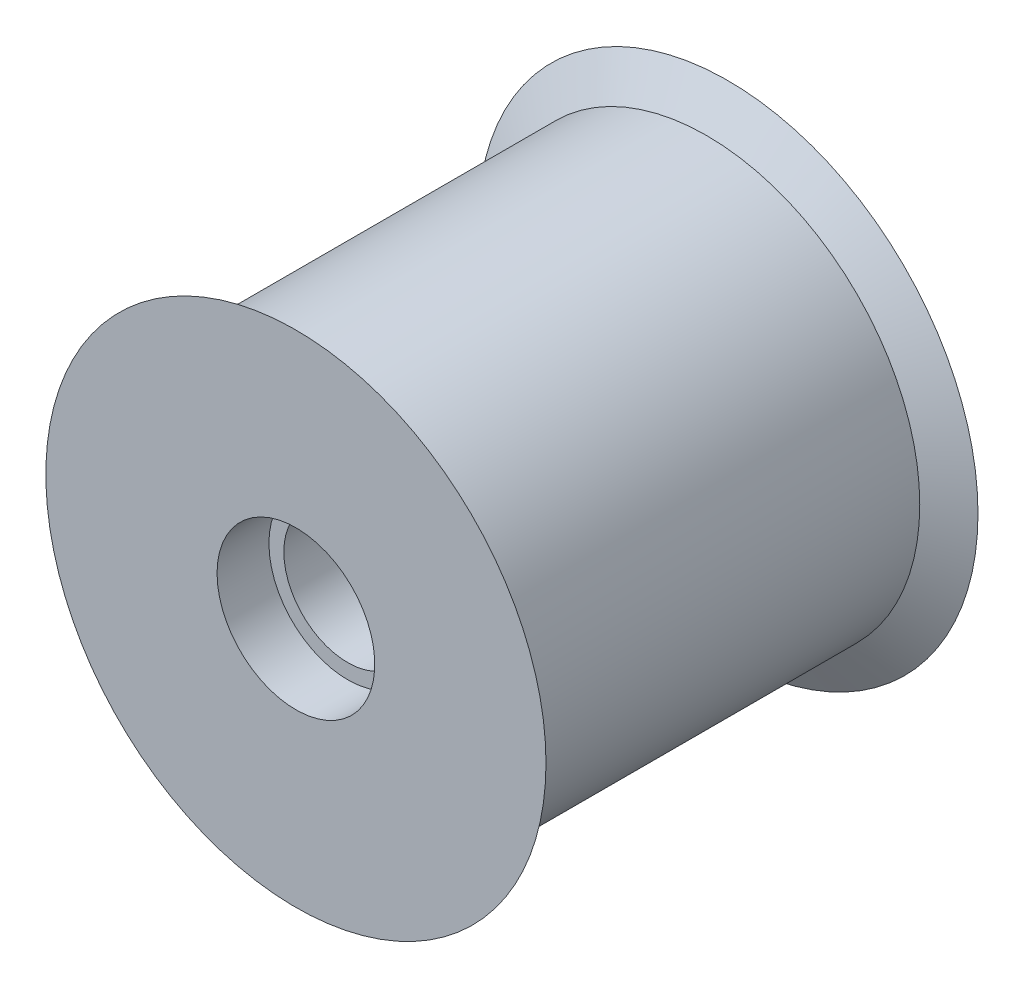
ISO-10303-21;
HEADER;
FILE_DESCRIPTION(('STEP AP214'),'2;1');
FILE_NAME('part.step','',(''),(''),'','','');
FILE_SCHEMA(('AUTOMOTIVE_DESIGN { 1 0 10303 214 1 1 1 1 }'));
ENDSEC;
DATA;
#1=APPLICATION_CONTEXT('core data for automotive mechanical design processes');
#2=APPLICATION_PROTOCOL_DEFINITION('international standard','automotive_design',2000,#1);
#3=PRODUCT_CONTEXT('',#1,'mechanical');
#4=PRODUCT('Part','Part','',(#3));
#5=PRODUCT_RELATED_PRODUCT_CATEGORY('part','',(#4));
#6=PRODUCT_DEFINITION_FORMATION('','',#4);
#7=PRODUCT_DEFINITION_CONTEXT('part definition',#1,'design');
#8=PRODUCT_DEFINITION('design','',#6,#7);
#9=PRODUCT_DEFINITION_SHAPE('','',#8);
#10=(LENGTH_UNIT() NAMED_UNIT(*) SI_UNIT(.MILLI.,.METRE.));
#11=(NAMED_UNIT(*) PLANE_ANGLE_UNIT() SI_UNIT($,.RADIAN.));
#12=(NAMED_UNIT(*) SI_UNIT($,.STERADIAN.) SOLID_ANGLE_UNIT());
#13=UNCERTAINTY_MEASURE_WITH_UNIT(LENGTH_MEASURE(1.E-05),#10,'distance_accuracy_value','');
#14=(GEOMETRIC_REPRESENTATION_CONTEXT(3) GLOBAL_UNCERTAINTY_ASSIGNED_CONTEXT((#13)) GLOBAL_UNIT_ASSIGNED_CONTEXT((#10,
#11,#12)) REPRESENTATION_CONTEXT('',''));
#15=CARTESIAN_POINT('',(0.,0.,0.));
#16=DIRECTION('',(0.,0.,1.));
#17=DIRECTION('',(1.,0.,0.));
#18=AXIS2_PLACEMENT_3D('',#15,#16,#17);
#19=CARTESIAN_POINT('',(-36.,0.,0.));
#20=DIRECTION('',(0.,0.,-1.));
#21=DIRECTION('',(-1.,0.,0.));
#22=AXIS2_PLACEMENT_3D('',#19,#20,#21);
#23=PLANE('',#22);
#24=CARTESIAN_POINT('',(0.,0.,0.));
#25=DIRECTION('',(0.,0.,-1.));
#26=DIRECTION('',(-1.,0.,0.));
#27=AXIS2_PLACEMENT_3D('',#24,#25,#26);
#28=CIRCLE('',#27,35.1961524227065);
#29=CARTESIAN_POINT('',(35.1961524227065,0.,0.));
#30=VERTEX_POINT('',#29);
#31=EDGE_CURVE('E10',#30,#30,#28,.F.);
#32=ORIENTED_EDGE('',*,*,#31,.T.);
#33=EDGE_LOOP('',(#32));
#34=FACE_BOUND('',#33,.T.);
#35=CARTESIAN_POINT('',(0.,0.,0.));
#36=DIRECTION('',(0.,0.,-1.));
#37=DIRECTION('',(-1.,0.,0.));
#38=AXIS2_PLACEMENT_3D('',#35,#36,#37);
#39=CIRCLE('',#38,11.1);
#40=CARTESIAN_POINT('',(-11.1,0.,0.));
#41=VERTEX_POINT('',#40);
#42=EDGE_CURVE('E67',#41,#41,#39,.T.);
#43=ORIENTED_EDGE('',*,*,#42,.T.);
#44=EDGE_LOOP('',(#43));
#45=FACE_BOUND('',#44,.T.);
#46=ADVANCED_FACE('F32',(#34,#45),#23,.F.);
#47=CARTESIAN_POINT('',(0.,0.,-60.8));
#48=DIRECTION('',(0.,0.,1.));
#49=DIRECTION('',(1.,0.,0.));
#50=AXIS2_PLACEMENT_3D('',#47,#48,#49);
#51=PLANE('',#50);
#52=CARTESIAN_POINT('',(0.,0.,-60.8));
#53=DIRECTION('',(0.,0.,1.));
#54=DIRECTION('',(1.,0.,0.));
#55=AXIS2_PLACEMENT_3D('',#52,#53,#54);
#56=CIRCLE('',#55,35.1961524227065);
#57=CARTESIAN_POINT('',(35.1961524227065,0.,-60.8));
#58=VERTEX_POINT('',#57);
#59=EDGE_CURVE('E39',#58,#58,#56,.F.);
#60=ORIENTED_EDGE('',*,*,#59,.T.);
#61=EDGE_LOOP('',(#60));
#62=FACE_BOUND('',#61,.T.);
#63=CARTESIAN_POINT('',(0.,0.,-60.8));
#64=DIRECTION('',(0.,0.,-1.));
#65=DIRECTION('',(-1.,0.,0.));
#66=AXIS2_PLACEMENT_3D('',#63,#64,#65);
#67=CIRCLE('',#66,11.1);
#68=CARTESIAN_POINT('',(-11.1,0.,-60.8));
#69=VERTEX_POINT('',#68);
#70=EDGE_CURVE('E52',#69,#69,#67,.T.);
#71=ORIENTED_EDGE('',*,*,#70,.F.);
#72=EDGE_LOOP('',(#71));
#73=FACE_BOUND('',#72,.T.);
#74=ADVANCED_FACE('F104',(#62,#73),#51,.F.);
#75=CARTESIAN_POINT('',(0.,0.,0.));
#76=DIRECTION('',(0.,0.,1.));
#77=DIRECTION('',(1.,0.,0.));
#78=AXIS2_PLACEMENT_3D('',#75,#76,#77);
#79=CYLINDRICAL_SURFACE('',#78,30.);
#80=CARTESIAN_POINT('',(0.,0.,-3.));
#81=DIRECTION('',(0.,0.,1.));
#82=DIRECTION('',(1.,0.,0.));
#83=AXIS2_PLACEMENT_3D('',#80,#81,#82);
#84=CIRCLE('',#83,30.);
#85=CARTESIAN_POINT('',(30.,0.,-3.));
#86=VERTEX_POINT('',#85);
#87=EDGE_CURVE('E47',#86,#86,#84,.T.);
#88=ORIENTED_EDGE('',*,*,#87,.F.);
#89=EDGE_LOOP('',(#88));
#90=FACE_BOUND('',#89,.T.);
#91=CARTESIAN_POINT('',(0.,0.,-57.8));
#92=DIRECTION('',(0.,0.,1.));
#93=DIRECTION('',(1.,0.,0.));
#94=AXIS2_PLACEMENT_3D('',#91,#92,#93);
#95=CIRCLE('',#94,30.);
#96=CARTESIAN_POINT('',(30.,0.,-57.8));
#97=VERTEX_POINT('',#96);
#98=EDGE_CURVE('E43',#97,#97,#95,.T.);
#99=ORIENTED_EDGE('',*,*,#98,.T.);
#100=EDGE_LOOP('',(#99));
#101=FACE_BOUND('',#100,.T.);
#102=ADVANCED_FACE('F100',(#90,#101),#79,.T.);
#103=CARTESIAN_POINT('',(0.,0.,-60.8));
#104=DIRECTION('',(0.,0.,-1.));
#105=DIRECTION('',(-1.,0.,0.));
#106=AXIS2_PLACEMENT_3D('',#103,#104,#105);
#107=CYLINDRICAL_SURFACE('',#106,11.1);
#108=CARTESIAN_POINT('',(0.,0.,-53.5));
#109=DIRECTION('',(0.,0.,-1.));
#110=DIRECTION('',(-1.,0.,0.));
#111=AXIS2_PLACEMENT_3D('',#108,#109,#110);
#112=CIRCLE('',#111,11.1);
#113=CARTESIAN_POINT('',(-11.1,0.,-53.5));
#114=VERTEX_POINT('',#113);
#115=EDGE_CURVE('E55',#114,#114,#112,.T.);
#116=ORIENTED_EDGE('',*,*,#115,.F.);
#117=EDGE_LOOP('',(#116));
#118=FACE_BOUND('',#117,.T.);
#119=ORIENTED_EDGE('',*,*,#70,.T.);
#120=EDGE_LOOP('',(#119));
#121=FACE_BOUND('',#120,.T.);
#122=ADVANCED_FACE('F94',(#118,#121),#107,.F.);
#123=CARTESIAN_POINT('',(-11.1,0.,-53.5));
#124=DIRECTION('',(0.,0.,1.));
#125=DIRECTION('',(1.,0.,0.));
#126=AXIS2_PLACEMENT_3D('',#123,#124,#125);
#127=PLANE('',#126);
#128=CARTESIAN_POINT('',(0.,0.,-53.5));
#129=DIRECTION('',(0.,0.,-1.));
#130=DIRECTION('',(-1.,0.,0.));
#131=AXIS2_PLACEMENT_3D('',#128,#129,#130);
#132=CIRCLE('',#131,9.);
#133=CARTESIAN_POINT('',(-9.,0.,-53.5));
#134=VERTEX_POINT('',#133);
#135=EDGE_CURVE('E58',#134,#134,#132,.T.);
#136=ORIENTED_EDGE('',*,*,#135,.F.);
#137=EDGE_LOOP('',(#136));
#138=FACE_BOUND('',#137,.T.);
#139=ORIENTED_EDGE('',*,*,#115,.T.);
#140=EDGE_LOOP('',(#139));
#141=FACE_BOUND('',#140,.T.);
#142=ADVANCED_FACE('F88',(#138,#141),#127,.F.);
#143=CARTESIAN_POINT('',(0.,0.,-60.8));
#144=DIRECTION('',(0.,0.,-1.));
#145=DIRECTION('',(-1.,0.,0.));
#146=AXIS2_PLACEMENT_3D('',#143,#144,#145);
#147=CYLINDRICAL_SURFACE('',#146,9.);
#148=CARTESIAN_POINT('',(0.,0.,-7.3));
#149=DIRECTION('',(0.,0.,-1.));
#150=DIRECTION('',(-1.,0.,0.));
#151=AXIS2_PLACEMENT_3D('',#148,#149,#150);
#152=CIRCLE('',#151,9.);
#153=CARTESIAN_POINT('',(-9.,0.,-7.3));
#154=VERTEX_POINT('',#153);
#155=EDGE_CURVE('E61',#154,#154,#152,.T.);
#156=ORIENTED_EDGE('',*,*,#155,.F.);
#157=EDGE_LOOP('',(#156));
#158=FACE_BOUND('',#157,.T.);
#159=ORIENTED_EDGE('',*,*,#135,.T.);
#160=EDGE_LOOP('',(#159));
#161=FACE_BOUND('',#160,.T.);
#162=ADVANCED_FACE('F82',(#158,#161),#147,.F.);
#163=CARTESIAN_POINT('',(-9.,0.,-7.3));
#164=DIRECTION('',(0.,0.,-1.));
#165=DIRECTION('',(-1.,0.,0.));
#166=AXIS2_PLACEMENT_3D('',#163,#164,#165);
#167=PLANE('',#166);
#168=CARTESIAN_POINT('',(0.,0.,-7.3));
#169=DIRECTION('',(0.,0.,-1.));
#170=DIRECTION('',(-1.,0.,0.));
#171=AXIS2_PLACEMENT_3D('',#168,#169,#170);
#172=CIRCLE('',#171,11.1);
#173=CARTESIAN_POINT('',(-11.1,0.,-7.3));
#174=VERTEX_POINT('',#173);
#175=EDGE_CURVE('E64',#174,#174,#172,.T.);
#176=ORIENTED_EDGE('',*,*,#175,.F.);
#177=EDGE_LOOP('',(#176));
#178=FACE_BOUND('',#177,.T.);
#179=ORIENTED_EDGE('',*,*,#155,.T.);
#180=EDGE_LOOP('',(#179));
#181=FACE_BOUND('',#180,.T.);
#182=ADVANCED_FACE('F76',(#178,#181),#167,.F.);
#183=CARTESIAN_POINT('',(0.,0.,-60.8));
#184=DIRECTION('',(0.,0.,-1.));
#185=DIRECTION('',(-1.,0.,0.));
#186=AXIS2_PLACEMENT_3D('',#183,#184,#185);
#187=CYLINDRICAL_SURFACE('',#186,11.1);
#188=ORIENTED_EDGE('',*,*,#42,.F.);
#189=EDGE_LOOP('',(#188));
#190=FACE_BOUND('',#189,.T.);
#191=ORIENTED_EDGE('',*,*,#175,.T.);
#192=EDGE_LOOP('',(#191));
#193=FACE_BOUND('',#192,.T.);
#194=ADVANCED_FACE('F72',(#190,#193),#187,.F.);
#195=CARTESIAN_POINT('',(0.,0.,-57.8));
#196=DIRECTION('',(0.,0.,-1.));
#197=DIRECTION('',(-1.,0.,0.));
#198=AXIS2_PLACEMENT_3D('',#195,#196,#197);
#199=CONICAL_SURFACE('',#198,30.,1.04719755119659);
#200=ORIENTED_EDGE('',*,*,#59,.F.);
#201=EDGE_LOOP('',(#200));
#202=FACE_BOUND('',#201,.T.);
#203=ORIENTED_EDGE('',*,*,#98,.F.);
#204=EDGE_LOOP('',(#203));
#205=FACE_BOUND('',#204,.T.);
#206=ADVANCED_FACE('F75',(#202,#205),#199,.T.);
#207=CARTESIAN_POINT('',(0.,0.,0.46410161513782));
#208=DIRECTION('',(0.,0.,1.));
#209=DIRECTION('',(1.,0.,0.));
#210=AXIS2_PLACEMENT_3D('',#207,#208,#209);
#211=CONICAL_SURFACE('',#210,36.,1.04719755119659);
#212=CARTESIAN_POINT('',(30.,0.,-3.));
#213=CARTESIAN_POINT('',(30.0541265877365,0.,-2.96875));
#214=CARTESIAN_POINT('',(30.108253175473,0.,-2.9375));
#215=CARTESIAN_POINT('',(30.2165063509461,0.,-2.875));
#216=CARTESIAN_POINT('',(30.2706329386826,0.,-2.84375));
#217=CARTESIAN_POINT('',(30.3788861141557,0.,-2.78125));
#218=CARTESIAN_POINT('',(30.4330127018922,0.,-2.75));
#219=CARTESIAN_POINT('',(30.5412658773652,0.,-2.6875));
#220=CARTESIAN_POINT('',(30.5953924651018,0.,-2.65625));
#221=CARTESIAN_POINT('',(30.7036456405748,0.,-2.59375));
#222=CARTESIAN_POINT('',(30.7577722283113,0.,-2.5625));
#223=CARTESIAN_POINT('',(30.8660254037844,0.,-2.5));
#224=CARTESIAN_POINT('',(30.9201519915209,0.,-2.46875));
#225=CARTESIAN_POINT('',(31.028405166994,0.,-2.40625));
#226=CARTESIAN_POINT('',(31.0825317547305,0.,-2.375));
#227=CARTESIAN_POINT('',(31.1907849302036,0.,-2.3125));
#228=CARTESIAN_POINT('',(31.2449115179401,0.,-2.28125));
#229=CARTESIAN_POINT('',(31.3531646934131,0.,-2.21875));
#230=CARTESIAN_POINT('',(31.4072912811497,0.,-2.1875));
#231=CARTESIAN_POINT('',(31.5155444566227,0.,-2.125));
#232=CARTESIAN_POINT('',(31.5696710443592,0.,-2.09375));
#233=CARTESIAN_POINT('',(31.6779242198323,0.,-2.03125));
#234=CARTESIAN_POINT('',(31.7320508075688,0.,-2.));
#235=CARTESIAN_POINT('',(31.8403039830419,0.,-1.9375));
#236=CARTESIAN_POINT('',(31.8944305707784,0.,-1.90625));
#237=CARTESIAN_POINT('',(32.0026837462515,0.,-1.84375));
#238=CARTESIAN_POINT('',(32.056810333988,0.,-1.8125));
#239=CARTESIAN_POINT('',(32.165063509461,0.,-1.75));
#240=CARTESIAN_POINT('',(32.2191900971976,0.,-1.71875));
#241=CARTESIAN_POINT('',(32.3274432726706,0.,-1.65625));
#242=CARTESIAN_POINT('',(32.3815698604071,0.,-1.625));
#243=CARTESIAN_POINT('',(32.4898230358802,0.,-1.5625));
#244=CARTESIAN_POINT('',(32.5439496236167,0.,-1.53125));
#245=CARTESIAN_POINT('',(32.6522027990898,0.,-1.46875));
#246=CARTESIAN_POINT('',(32.7063293868263,0.,-1.4375));
#247=CARTESIAN_POINT('',(32.8145825622994,0.,-1.375));
#248=CARTESIAN_POINT('',(32.8687091500359,0.,-1.34375));
#249=CARTESIAN_POINT('',(32.9769623255089,0.,-1.28125));
#250=CARTESIAN_POINT('',(33.0310889132455,0.,-1.25));
#251=CARTESIAN_POINT('',(33.1393420887185,0.,-1.1875));
#252=CARTESIAN_POINT('',(33.193468676455,0.,-1.15625));
#253=CARTESIAN_POINT('',(33.3017218519281,0.,-1.09375));
#254=CARTESIAN_POINT('',(33.3558484396646,0.,-1.0625));
#255=CARTESIAN_POINT('',(33.4641016151377,0.,-1.));
#256=CARTESIAN_POINT('',(33.5182282028742,0.,-0.96875));
#257=CARTESIAN_POINT('',(33.6264813783473,0.,-0.90625));
#258=CARTESIAN_POINT('',(33.6806079660838,0.,-0.875000000000001));
#259=CARTESIAN_POINT('',(33.7888611415568,0.,-0.812500000000001));
#260=CARTESIAN_POINT('',(33.8429877292934,0.,-0.78125));
#261=CARTESIAN_POINT('',(33.9512409047664,0.,-0.71875));
#262=CARTESIAN_POINT('',(34.0053674925029,0.,-0.687500000000001));
#263=CARTESIAN_POINT('',(34.113620667976,0.,-0.625000000000001));
#264=CARTESIAN_POINT('',(34.1677472557125,0.,-0.59375));
#265=CARTESIAN_POINT('',(34.2760004311856,0.,-0.53125));
#266=CARTESIAN_POINT('',(34.3301270189221,0.,-0.500000000000001));
#267=CARTESIAN_POINT('',(34.4383801943952,0.,-0.437500000000001));
#268=CARTESIAN_POINT('',(34.4925067821317,0.,-0.40625));
#269=CARTESIAN_POINT('',(34.6007599576047,0.,-0.34375));
#270=CARTESIAN_POINT('',(34.6548865453413,0.,-0.312500000000001));
#271=CARTESIAN_POINT('',(34.7631397208143,0.,-0.250000000000001));
#272=CARTESIAN_POINT('',(34.8172663085508,0.,-0.21875));
#273=CARTESIAN_POINT('',(34.9255194840239,0.,-0.156249999999999));
#274=CARTESIAN_POINT('',(34.9796460717604,0.,-0.125));
#275=CARTESIAN_POINT('',(35.0878992472335,0.,-0.0625000000000003));
#276=CARTESIAN_POINT('',(35.14202583497,0.,-0.0312500000000007));
#277=CARTESIAN_POINT('',(35.1961524227065,0.,0.));
#278=B_SPLINE_CURVE_WITH_KNOTS('',3,(#212,#213,#214,#215,#216,#217,#218,#219,#220,#221,#222,
#223,#224,#225,#226,#227,#228,#229,#230,#231,#232,#233,#234,#235,#236,#237,#238,#239,#240,#241,
#242,#243,#244,#245,#246,#247,#248,#249,#250,#251,#252,#253,#254,#255,#256,#257,#258,#259,#260,
#261,#262,#263,#264,#265,#266,#267,#268,#269,#270,#271,#272,#273,#274,#275,#276,#277),
.UNSPECIFIED.,.F.,.F.,(4,2,2,2,2,2,2,2,2,2,2,2,2,2,2,2,2,2,2,2,2,2,2,2,2,2,2,2,2,2,2,2,4),(0.,
0.187499999999998,0.374999999999995,0.562499999999993,0.749999999999991,0.937499999999988,
1.12499999999999,1.31249999999999,1.49999999999998,1.68749999999998,1.87499999999998,
2.06249999999998,2.24999999999997,2.43749999999997,2.62499999999997,2.81249999999997,
2.99999999999997,3.18749999999996,3.37499999999996,3.56249999999996,3.74999999999996,
3.93749999999996,4.12499999999995,4.31249999999996,4.49999999999995,4.68749999999995,
4.87499999999995,5.06249999999995,5.24999999999994,5.43749999999994,5.62499999999994,
5.81249999999994,5.99999999999994),.UNSPECIFIED.);
#279=EDGE_CURVE('BSEAM34',#86,#30,#278,.T.);
#280=ORIENTED_EDGE('',*,*,#87,.T.);
#281=ORIENTED_EDGE('',*,*,#31,.F.);
#282=ORIENTED_EDGE('',*,*,#279,.T.);
#283=ORIENTED_EDGE('',*,*,#279,.F.);
#284=EDGE_LOOP('',(#280,#282,#281,#283));
#285=FACE_BOUND('',#284,.T.);
#286=ADVANCED_FACE('F34',(#285),#211,.T.);
#287=CLOSED_SHELL('',(#46,#74,#102,#122,#142,#162,#182,#194,#206,#286));
#288=MANIFOLD_SOLID_BREP('B2',#287);
#289=ADVANCED_BREP_SHAPE_REPRESENTATION('',(#18,#288),#14);
#290=SHAPE_DEFINITION_REPRESENTATION(#9,#289);
ENDSEC;
END-ISO-10303-21;
